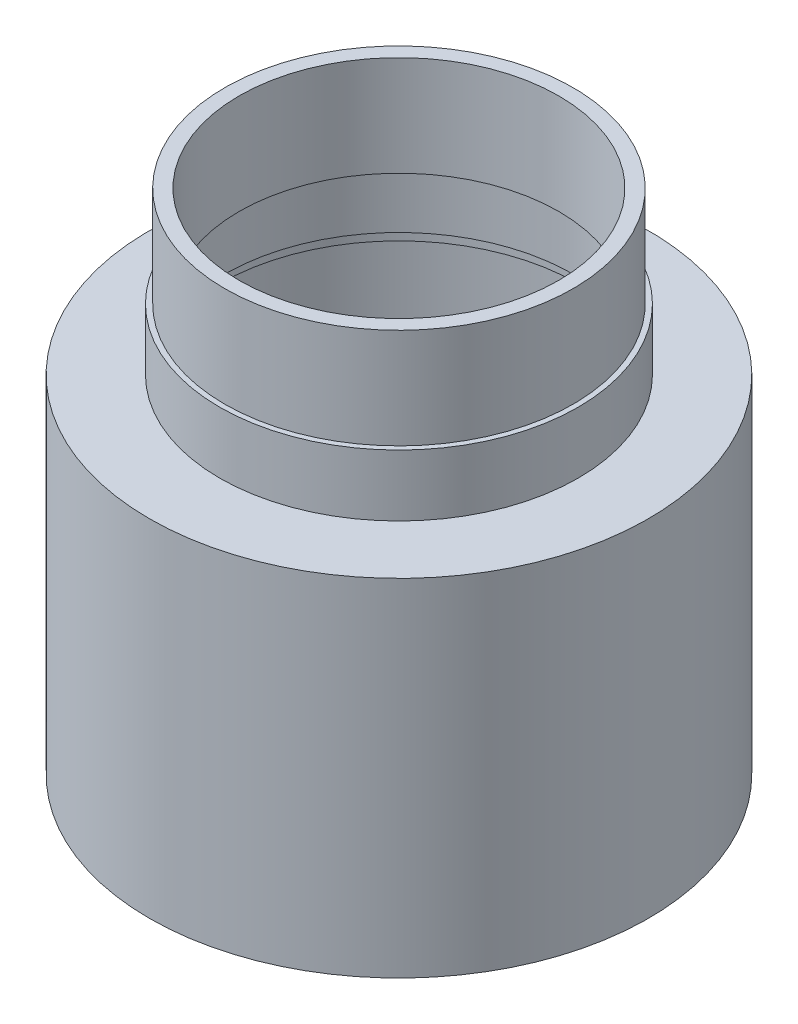
ISO-10303-21;
HEADER;
FILE_DESCRIPTION(('STEP AP214'),'2;1');
FILE_NAME('part.step','',(''),(''),'','','');
FILE_SCHEMA(('AUTOMOTIVE_DESIGN { 1 0 10303 214 1 1 1 1 }'));
ENDSEC;
DATA;
#1=APPLICATION_CONTEXT('core data for automotive mechanical design processes');
#2=APPLICATION_PROTOCOL_DEFINITION('international standard','automotive_design',2000,#1);
#3=PRODUCT_CONTEXT('',#1,'mechanical');
#4=PRODUCT('Part','Part','',(#3));
#5=PRODUCT_RELATED_PRODUCT_CATEGORY('part','',(#4));
#6=PRODUCT_DEFINITION_FORMATION('','',#4);
#7=PRODUCT_DEFINITION_CONTEXT('part definition',#1,'design');
#8=PRODUCT_DEFINITION('design','',#6,#7);
#9=PRODUCT_DEFINITION_SHAPE('','',#8);
#10=(LENGTH_UNIT() NAMED_UNIT(*) SI_UNIT(.MILLI.,.METRE.));
#11=(NAMED_UNIT(*) PLANE_ANGLE_UNIT() SI_UNIT($,.RADIAN.));
#12=(NAMED_UNIT(*) SI_UNIT($,.STERADIAN.) SOLID_ANGLE_UNIT());
#13=UNCERTAINTY_MEASURE_WITH_UNIT(LENGTH_MEASURE(1.E-05),#10,'distance_accuracy_value','');
#14=(GEOMETRIC_REPRESENTATION_CONTEXT(3) GLOBAL_UNCERTAINTY_ASSIGNED_CONTEXT((#13)) GLOBAL_UNIT_ASSIGNED_CONTEXT((#10,
#11,#12)) REPRESENTATION_CONTEXT('',''));
#15=CARTESIAN_POINT('',(0.,0.,0.));
#16=DIRECTION('',(0.,0.,1.));
#17=DIRECTION('',(1.,0.,0.));
#18=AXIS2_PLACEMENT_3D('',#15,#16,#17);
#19=CARTESIAN_POINT('',(0.,23.38,0.));
#20=DIRECTION('',(0.,1.,0.));
#21=DIRECTION('',(0.,0.,1.));
#22=AXIS2_PLACEMENT_3D('',#19,#20,#21);
#23=PLANE('',#22);
#24=CARTESIAN_POINT('',(0.,23.38,0.));
#25=DIRECTION('',(0.,1.,0.));
#26=DIRECTION('',(0.,0.,1.));
#27=AXIS2_PLACEMENT_3D('',#24,#25,#26);
#28=CIRCLE('',#27,8.02);
#29=CARTESIAN_POINT('',(0.,23.38,8.02));
#30=VERTEX_POINT('',#29);
#31=EDGE_CURVE('E12',#30,#30,#28,.T.);
#32=ORIENTED_EDGE('',*,*,#31,.T.);
#33=EDGE_LOOP('',(#32));
#34=FACE_BOUND('',#33,.T.);
#35=CARTESIAN_POINT('',(0.,23.38,0.));
#36=DIRECTION('',(0.,1.,0.));
#37=DIRECTION('',(0.,0.,1.));
#38=AXIS2_PLACEMENT_3D('',#35,#36,#37);
#39=CIRCLE('',#38,7.36);
#40=CARTESIAN_POINT('',(0.,23.38,7.36));
#41=VERTEX_POINT('',#40);
#42=EDGE_CURVE('E65',#41,#41,#39,.T.);
#43=ORIENTED_EDGE('',*,*,#42,.F.);
#44=EDGE_LOOP('',(#43));
#45=FACE_BOUND('',#44,.T.);
#46=ADVANCED_FACE('F54',(#34,#45),#23,.T.);
#47=CARTESIAN_POINT('',(0.,18.77,0.));
#48=DIRECTION('',(0.,1.,0.));
#49=DIRECTION('',(0.,0.,1.));
#50=AXIS2_PLACEMENT_3D('',#47,#48,#49);
#51=PLANE('',#50);
#52=CARTESIAN_POINT('',(0.,18.77,0.));
#53=DIRECTION('',(0.,1.,0.));
#54=DIRECTION('',(0.,0.,1.));
#55=AXIS2_PLACEMENT_3D('',#52,#53,#54);
#56=CIRCLE('',#55,8.02);
#57=CARTESIAN_POINT('',(0.,18.77,8.02));
#58=VERTEX_POINT('',#57);
#59=EDGE_CURVE('E58',#58,#58,#56,.T.);
#60=ORIENTED_EDGE('',*,*,#59,.F.);
#61=EDGE_LOOP('',(#60));
#62=FACE_BOUND('',#61,.T.);
#63=CARTESIAN_POINT('',(0.,18.77,0.));
#64=DIRECTION('',(0.,1.,0.));
#65=DIRECTION('',(0.,0.,1.));
#66=AXIS2_PLACEMENT_3D('',#63,#64,#65);
#67=CIRCLE('',#66,7.36);
#68=CARTESIAN_POINT('',(0.,18.77,7.36));
#69=VERTEX_POINT('',#68);
#70=EDGE_CURVE('E67',#69,#69,#67,.T.);
#71=ORIENTED_EDGE('',*,*,#70,.T.);
#72=EDGE_LOOP('',(#71));
#73=FACE_BOUND('',#72,.T.);
#74=ADVANCED_FACE('F77',(#62,#73),#51,.F.);
#75=CARTESIAN_POINT('',(0.,23.38,0.));
#76=DIRECTION('',(0.,-1.,0.));
#77=DIRECTION('',(0.,0.,-1.));
#78=AXIS2_PLACEMENT_3D('',#75,#76,#77);
#79=CYLINDRICAL_SURFACE('',#78,8.02);
#80=ORIENTED_EDGE('',*,*,#31,.F.);
#81=EDGE_LOOP('',(#80));
#82=FACE_BOUND('',#81,.T.);
#83=ORIENTED_EDGE('',*,*,#59,.T.);
#84=EDGE_LOOP('',(#83));
#85=FACE_BOUND('',#84,.T.);
#86=ADVANCED_FACE('F56',(#82,#85),#79,.T.);
#87=CARTESIAN_POINT('',(0.,23.38,0.));
#88=DIRECTION('',(0.,-1.,0.));
#89=DIRECTION('',(0.,0.,-1.));
#90=AXIS2_PLACEMENT_3D('',#87,#88,#89);
#91=CYLINDRICAL_SURFACE('',#90,7.36);
#92=ORIENTED_EDGE('',*,*,#42,.T.);
#93=EDGE_LOOP('',(#92));
#94=FACE_BOUND('',#93,.T.);
#95=ORIENTED_EDGE('',*,*,#70,.F.);
#96=EDGE_LOOP('',(#95));
#97=FACE_BOUND('',#96,.T.);
#98=ADVANCED_FACE('F73',(#94,#97),#91,.F.);
#99=CLOSED_SHELL('',(#46,#74,#86,#98));
#100=MANIFOLD_SOLID_BREP('B2',#99);
#101=CARTESIAN_POINT('',(0.,18.77,0.));
#102=DIRECTION('',(0.,1.,0.));
#103=DIRECTION('',(0.,0.,1.));
#104=AXIS2_PLACEMENT_3D('',#101,#102,#103);
#105=PLANE('',#104);
#106=CARTESIAN_POINT('',(0.,18.77,0.));
#107=DIRECTION('',(0.,1.,0.));
#108=DIRECTION('',(0.,0.,1.));
#109=AXIS2_PLACEMENT_3D('',#106,#107,#108);
#110=CIRCLE('',#109,8.255);
#111=CARTESIAN_POINT('',(0.,18.77,8.255));
#112=VERTEX_POINT('',#111);
#113=EDGE_CURVE('E53',#112,#112,#110,.T.);
#114=ORIENTED_EDGE('',*,*,#113,.T.);
#115=EDGE_LOOP('',(#114));
#116=FACE_BOUND('',#115,.T.);
#117=CARTESIAN_POINT('',(0.,18.77,0.));
#118=DIRECTION('',(0.,1.,0.));
#119=DIRECTION('',(0.,0.,1.));
#120=AXIS2_PLACEMENT_3D('',#117,#118,#119);
#121=CIRCLE('',#120,8.02);
#122=CARTESIAN_POINT('',(0.,18.77,8.02));
#123=VERTEX_POINT('',#122);
#124=EDGE_CURVE('E134',#123,#123,#121,.T.);
#125=ORIENTED_EDGE('',*,*,#124,.F.);
#126=EDGE_LOOP('',(#125));
#127=FACE_BOUND('',#126,.T.);
#128=ADVANCED_FACE('F123',(#116,#127),#105,.T.);
#129=CARTESIAN_POINT('',(0.,15.94,0.));
#130=DIRECTION('',(0.,1.,0.));
#131=DIRECTION('',(0.,0.,1.));
#132=AXIS2_PLACEMENT_3D('',#129,#130,#131);
#133=PLANE('',#132);
#134=CARTESIAN_POINT('',(0.,15.94,0.));
#135=DIRECTION('',(0.,1.,0.));
#136=DIRECTION('',(0.,0.,1.));
#137=AXIS2_PLACEMENT_3D('',#134,#135,#136);
#138=CIRCLE('',#137,8.255);
#139=CARTESIAN_POINT('',(0.,15.94,8.255));
#140=VERTEX_POINT('',#139);
#141=EDGE_CURVE('E127',#140,#140,#138,.T.);
#142=ORIENTED_EDGE('',*,*,#141,.F.);
#143=EDGE_LOOP('',(#142));
#144=FACE_BOUND('',#143,.T.);
#145=CARTESIAN_POINT('',(0.,15.94,0.));
#146=DIRECTION('',(0.,1.,0.));
#147=DIRECTION('',(0.,0.,1.));
#148=AXIS2_PLACEMENT_3D('',#145,#146,#147);
#149=CIRCLE('',#148,8.02);
#150=CARTESIAN_POINT('',(0.,15.94,8.02));
#151=VERTEX_POINT('',#150);
#152=EDGE_CURVE('E136',#151,#151,#149,.T.);
#153=ORIENTED_EDGE('',*,*,#152,.T.);
#154=EDGE_LOOP('',(#153));
#155=FACE_BOUND('',#154,.T.);
#156=ADVANCED_FACE('F146',(#144,#155),#133,.F.);
#157=CARTESIAN_POINT('',(0.,18.77,0.));
#158=DIRECTION('',(0.,-1.,0.));
#159=DIRECTION('',(0.,0.,-1.));
#160=AXIS2_PLACEMENT_3D('',#157,#158,#159);
#161=CYLINDRICAL_SURFACE('',#160,8.255);
#162=ORIENTED_EDGE('',*,*,#113,.F.);
#163=EDGE_LOOP('',(#162));
#164=FACE_BOUND('',#163,.T.);
#165=ORIENTED_EDGE('',*,*,#141,.T.);
#166=EDGE_LOOP('',(#165));
#167=FACE_BOUND('',#166,.T.);
#168=ADVANCED_FACE('F125',(#164,#167),#161,.T.);
#169=CARTESIAN_POINT('',(0.,18.77,0.));
#170=DIRECTION('',(0.,-1.,0.));
#171=DIRECTION('',(0.,0.,-1.));
#172=AXIS2_PLACEMENT_3D('',#169,#170,#171);
#173=CYLINDRICAL_SURFACE('',#172,8.02);
#174=ORIENTED_EDGE('',*,*,#124,.T.);
#175=EDGE_LOOP('',(#174));
#176=FACE_BOUND('',#175,.T.);
#177=ORIENTED_EDGE('',*,*,#152,.F.);
#178=EDGE_LOOP('',(#177));
#179=FACE_BOUND('',#178,.T.);
#180=ADVANCED_FACE('F142',(#176,#179),#173,.F.);
#181=CLOSED_SHELL('',(#128,#156,#168,#180));
#182=MANIFOLD_SOLID_BREP('B7',#181);
#183=CARTESIAN_POINT('',(0.,15.94,0.));
#184=DIRECTION('',(0.,1.,0.));
#185=DIRECTION('',(0.,0.,1.));
#186=AXIS2_PLACEMENT_3D('',#183,#184,#185);
#187=PLANE('',#186);
#188=CARTESIAN_POINT('',(0.,15.94,0.));
#189=DIRECTION('',(0.,1.,0.));
#190=DIRECTION('',(0.,0.,1.));
#191=AXIS2_PLACEMENT_3D('',#188,#189,#190);
#192=CIRCLE('',#191,11.4900000000002);
#193=CARTESIAN_POINT('',(0.,15.94,11.4900000000002));
#194=VERTEX_POINT('',#193);
#195=EDGE_CURVE('E191',#194,#194,#192,.T.);
#196=ORIENTED_EDGE('',*,*,#195,.T.);
#197=EDGE_LOOP('',(#196));
#198=FACE_BOUND('',#197,.T.);
#199=CARTESIAN_POINT('',(0.,15.94,0.));
#200=DIRECTION('',(0.,-1.,0.));
#201=DIRECTION('',(0.,0.,-1.));
#202=AXIS2_PLACEMENT_3D('',#199,#200,#201);
#203=CIRCLE('',#202,8.255);
#204=CARTESIAN_POINT('',(0.,15.94,-8.255));
#205=VERTEX_POINT('',#204);
#206=EDGE_CURVE('E205',#205,#205,#203,.T.);
#207=ORIENTED_EDGE('',*,*,#206,.T.);
#208=EDGE_LOOP('',(#207));
#209=FACE_BOUND('',#208,.T.);
#210=ADVANCED_FACE('F184',(#198,#209),#187,.T.);
#211=CARTESIAN_POINT('',(0.,0.,0.));
#212=DIRECTION('',(0.,1.,0.));
#213=DIRECTION('',(0.,0.,1.));
#214=AXIS2_PLACEMENT_3D('',#211,#212,#213);
#215=PLANE('',#214);
#216=CARTESIAN_POINT('',(0.,0.,0.));
#217=DIRECTION('',(0.,1.,0.));
#218=DIRECTION('',(0.,0.,1.));
#219=AXIS2_PLACEMENT_3D('',#216,#217,#218);
#220=CIRCLE('',#219,11.4900000000002);
#221=CARTESIAN_POINT('',(0.,0.,11.4900000000002));
#222=VERTEX_POINT('',#221);
#223=EDGE_CURVE('E195',#222,#222,#220,.T.);
#224=ORIENTED_EDGE('',*,*,#223,.F.);
#225=EDGE_LOOP('',(#224));
#226=FACE_BOUND('',#225,.T.);
#227=CARTESIAN_POINT('',(0.,0.,0.));
#228=DIRECTION('',(0.,1.,0.));
#229=DIRECTION('',(0.,0.,1.));
#230=AXIS2_PLACEMENT_3D('',#227,#228,#229);
#231=CIRCLE('',#230,10.28);
#232=CARTESIAN_POINT('',(0.,0.,10.28));
#233=VERTEX_POINT('',#232);
#234=EDGE_CURVE('E200',#233,#233,#231,.T.);
#235=ORIENTED_EDGE('',*,*,#234,.T.);
#236=EDGE_LOOP('',(#235));
#237=FACE_BOUND('',#236,.T.);
#238=ADVANCED_FACE('F226',(#226,#237),#215,.F.);
#239=CARTESIAN_POINT('',(0.,15.94,0.));
#240=DIRECTION('',(0.,-1.,0.));
#241=DIRECTION('',(0.,0.,-1.));
#242=AXIS2_PLACEMENT_3D('',#239,#240,#241);
#243=CYLINDRICAL_SURFACE('',#242,11.4900000000002);
#244=ORIENTED_EDGE('',*,*,#195,.F.);
#245=EDGE_LOOP('',(#244));
#246=FACE_BOUND('',#245,.T.);
#247=ORIENTED_EDGE('',*,*,#223,.T.);
#248=EDGE_LOOP('',(#247));
#249=FACE_BOUND('',#248,.T.);
#250=ADVANCED_FACE('F186',(#246,#249),#243,.T.);
#251=CARTESIAN_POINT('',(0.,15.94,0.));
#252=DIRECTION('',(0.,-1.,0.));
#253=DIRECTION('',(0.,0.,-1.));
#254=AXIS2_PLACEMENT_3D('',#251,#252,#253);
#255=CYLINDRICAL_SURFACE('',#254,10.28);
#256=CARTESIAN_POINT('',(0.,15.44,0.));
#257=DIRECTION('',(0.,-1.,0.));
#258=DIRECTION('',(0.,0.,-1.));
#259=AXIS2_PLACEMENT_3D('',#256,#257,#258);
#260=CIRCLE('',#259,10.28);
#261=CARTESIAN_POINT('',(0.,15.44,-10.28));
#262=VERTEX_POINT('',#261);
#263=EDGE_CURVE('E122',#262,#262,#260,.T.);
#264=ORIENTED_EDGE('',*,*,#263,.F.);
#265=EDGE_LOOP('',(#264));
#266=FACE_BOUND('',#265,.T.);
#267=ORIENTED_EDGE('',*,*,#234,.F.);
#268=EDGE_LOOP('',(#267));
#269=FACE_BOUND('',#268,.T.);
#270=ADVANCED_FACE('F216',(#266,#269),#255,.F.);
#271=CARTESIAN_POINT('',(0.,15.44,0.));
#272=DIRECTION('',(0.,-1.,0.));
#273=DIRECTION('',(0.,0.,-1.));
#274=AXIS2_PLACEMENT_3D('',#271,#272,#273);
#275=PLANE('',#274);
#276=ORIENTED_EDGE('',*,*,#263,.T.);
#277=EDGE_LOOP('',(#276));
#278=FACE_BOUND('',#277,.T.);
#279=CARTESIAN_POINT('',(0.,15.44,0.));
#280=DIRECTION('',(0.,-1.,0.));
#281=DIRECTION('',(0.,0.,-1.));
#282=AXIS2_PLACEMENT_3D('',#279,#280,#281);
#283=CIRCLE('',#282,8.255);
#284=CARTESIAN_POINT('',(0.,15.44,-8.255));
#285=VERTEX_POINT('',#284);
#286=EDGE_CURVE('E204',#285,#285,#283,.T.);
#287=ORIENTED_EDGE('',*,*,#286,.F.);
#288=EDGE_LOOP('',(#287));
#289=FACE_BOUND('',#288,.T.);
#290=ADVANCED_FACE('F214',(#278,#289),#275,.T.);
#291=CARTESIAN_POINT('',(0.,15.44,0.));
#292=DIRECTION('',(0.,1.,0.));
#293=DIRECTION('',(0.,0.,1.));
#294=AXIS2_PLACEMENT_3D('',#291,#292,#293);
#295=CYLINDRICAL_SURFACE('',#294,8.255);
#296=ORIENTED_EDGE('',*,*,#286,.T.);
#297=EDGE_LOOP('',(#296));
#298=FACE_BOUND('',#297,.T.);
#299=ORIENTED_EDGE('',*,*,#206,.F.);
#300=EDGE_LOOP('',(#299));
#301=FACE_BOUND('',#300,.T.);
#302=ADVANCED_FACE('F211',(#298,#301),#295,.F.);
#303=CLOSED_SHELL('',(#210,#238,#250,#270,#290,#302));
#304=MANIFOLD_SOLID_BREP('B48',#303);
#305=ADVANCED_BREP_SHAPE_REPRESENTATION('',(#18,#100,#182,#304),#14);
#306=SHAPE_DEFINITION_REPRESENTATION(#9,#305);
ENDSEC;
END-ISO-10303-21;
